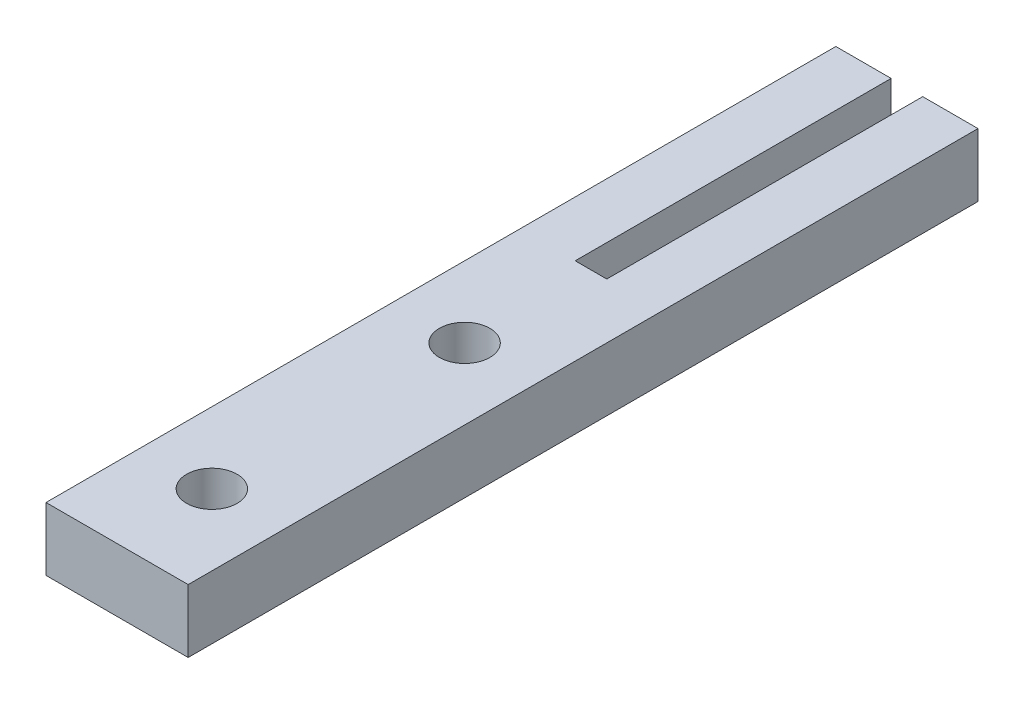
ISO-10303-21;
HEADER;
FILE_DESCRIPTION(('STEP AP214'),'2;1');
FILE_NAME('part.step','',(''),(''),'','','');
FILE_SCHEMA(('AUTOMOTIVE_DESIGN { 1 0 10303 214 1 1 1 1 }'));
ENDSEC;
DATA;
#1=APPLICATION_CONTEXT('core data for automotive mechanical design processes');
#2=APPLICATION_PROTOCOL_DEFINITION('international standard','automotive_design',2000,#1);
#3=PRODUCT_CONTEXT('',#1,'mechanical');
#4=PRODUCT('Part','Part','',(#3));
#5=PRODUCT_RELATED_PRODUCT_CATEGORY('part','',(#4));
#6=PRODUCT_DEFINITION_FORMATION('','',#4);
#7=PRODUCT_DEFINITION_CONTEXT('part definition',#1,'design');
#8=PRODUCT_DEFINITION('design','',#6,#7);
#9=PRODUCT_DEFINITION_SHAPE('','',#8);
#10=(LENGTH_UNIT() NAMED_UNIT(*) SI_UNIT(.MILLI.,.METRE.));
#11=(NAMED_UNIT(*) PLANE_ANGLE_UNIT() SI_UNIT($,.RADIAN.));
#12=(NAMED_UNIT(*) SI_UNIT($,.STERADIAN.) SOLID_ANGLE_UNIT());
#13=UNCERTAINTY_MEASURE_WITH_UNIT(LENGTH_MEASURE(1.E-05),#10,'distance_accuracy_value','');
#14=(GEOMETRIC_REPRESENTATION_CONTEXT(3) GLOBAL_UNCERTAINTY_ASSIGNED_CONTEXT((#13)) GLOBAL_UNIT_ASSIGNED_CONTEXT((#10,
#11,#12)) REPRESENTATION_CONTEXT('',''));
#15=CARTESIAN_POINT('',(0.,0.,0.));
#16=DIRECTION('',(0.,0.,1.));
#17=DIRECTION('',(1.,0.,0.));
#18=AXIS2_PLACEMENT_3D('',#15,#16,#17);
#19=CARTESIAN_POINT('',(0.,4.,-28.));
#20=DIRECTION('',(0.,0.,-1.));
#21=DIRECTION('',(-1.,0.,0.));
#22=AXIS2_PLACEMENT_3D('',#19,#20,#21);
#23=PLANE('',#22);
#24=DIRECTION('',(1.,0.,0.));
#25=VECTOR('',#24,1.);
#26=CARTESIAN_POINT('',(0.,2.,-28.));
#27=LINE('',#26,#25);
#28=CARTESIAN_POINT('',(-0.999999999999998,2.,-28.));
#29=VERTEX_POINT('',#28);
#30=CARTESIAN_POINT('',(0.999999999999994,2.,-28.));
#31=VERTEX_POINT('',#30);
#32=EDGE_CURVE('E109',#29,#31,#27,.T.);
#33=ORIENTED_EDGE('',*,*,#32,.T.);
#34=DIRECTION('',(0.,-1.,0.));
#35=VECTOR('',#34,1.);
#36=CARTESIAN_POINT('',(0.999999999999994,72.7009615312045,-28.));
#37=LINE('',#36,#35);
#38=CARTESIAN_POINT('',(0.999999999999994,4.,-28.));
#39=VERTEX_POINT('',#38);
#40=EDGE_CURVE('E124',#39,#31,#37,.T.);
#41=ORIENTED_EDGE('',*,*,#40,.F.);
#42=DIRECTION('',(1.,0.,0.));
#43=VECTOR('',#42,1.);
#44=CARTESIAN_POINT('',(0.,4.,-28.));
#45=LINE('',#44,#43);
#46=CARTESIAN_POINT('',(4.49999999999999,4.,-28.));
#47=VERTEX_POINT('',#46);
#48=EDGE_CURVE('E148',#39,#47,#45,.T.);
#49=ORIENTED_EDGE('',*,*,#48,.T.);
#50=DIRECTION('',(0.,-1.,0.));
#51=VECTOR('',#50,1.);
#52=CARTESIAN_POINT('',(4.49999999999999,4.,-28.));
#53=LINE('',#52,#51);
#54=CARTESIAN_POINT('',(4.49999999999999,0.,-28.));
#55=VERTEX_POINT('',#54);
#56=EDGE_CURVE('E171',#47,#55,#53,.T.);
#57=ORIENTED_EDGE('',*,*,#56,.T.);
#58=DIRECTION('',(1.,0.,0.));
#59=VECTOR('',#58,1.);
#60=CARTESIAN_POINT('',(0.,0.,-28.));
#61=LINE('',#60,#59);
#62=CARTESIAN_POINT('',(-4.5,0.,-28.));
#63=VERTEX_POINT('',#62);
#64=EDGE_CURVE('E165',#63,#55,#61,.T.);
#65=ORIENTED_EDGE('',*,*,#64,.F.);
#66=DIRECTION('',(0.,-1.,0.));
#67=VECTOR('',#66,1.);
#68=CARTESIAN_POINT('',(-4.5,4.,-28.));
#69=LINE('',#68,#67);
#70=CARTESIAN_POINT('',(-4.5,4.,-28.));
#71=VERTEX_POINT('',#70);
#72=EDGE_CURVE('E59',#71,#63,#69,.T.);
#73=ORIENTED_EDGE('',*,*,#72,.F.);
#74=CARTESIAN_POINT('',(-0.999999999999997,4.,-28.));
#75=VERTEX_POINT('',#74);
#76=EDGE_CURVE('E149',#71,#75,#45,.T.);
#77=ORIENTED_EDGE('',*,*,#76,.T.);
#78=DIRECTION('',(0.,-1.,0.));
#79=VECTOR('',#78,1.);
#80=CARTESIAN_POINT('',(-0.999999999999999,72.7009615312045,-28.));
#81=LINE('',#80,#79);
#82=EDGE_CURVE('E50',#75,#29,#81,.T.);
#83=ORIENTED_EDGE('',*,*,#82,.T.);
#84=EDGE_LOOP('',(#33,#41,#49,#57,#65,#73,#77,#83));
#85=FACE_BOUND('',#84,.T.);
#86=ADVANCED_FACE('F35',(#85),#23,.T.);
#87=CARTESIAN_POINT('',(0.,4.,0.));
#88=DIRECTION('',(0.,1.,0.));
#89=DIRECTION('',(0.,0.,1.));
#90=AXIS2_PLACEMENT_3D('',#87,#88,#89);
#91=PLANE('',#90);
#92=CARTESIAN_POINT('',(0.,4.,16.));
#93=DIRECTION('',(0.,1.,0.));
#94=DIRECTION('',(0.,0.,1.));
#95=AXIS2_PLACEMENT_3D('',#92,#93,#94);
#96=CIRCLE('',#95,1.6);
#97=CARTESIAN_POINT('',(0.,4.,17.6));
#98=VERTEX_POINT('',#97);
#99=EDGE_CURVE('E136',#98,#98,#96,.T.);
#100=ORIENTED_EDGE('',*,*,#99,.F.);
#101=EDGE_LOOP('',(#100));
#102=FACE_BOUND('',#101,.T.);
#103=CARTESIAN_POINT('',(0.,4.,0.));
#104=DIRECTION('',(0.,1.,0.));
#105=DIRECTION('',(0.,0.,1.));
#106=AXIS2_PLACEMENT_3D('',#103,#104,#105);
#107=CIRCLE('',#106,1.6);
#108=CARTESIAN_POINT('',(0.,4.,1.6));
#109=VERTEX_POINT('',#108);
#110=EDGE_CURVE('E151',#109,#109,#107,.T.);
#111=ORIENTED_EDGE('',*,*,#110,.F.);
#112=EDGE_LOOP('',(#111));
#113=FACE_BOUND('',#112,.T.);
#114=ORIENTED_EDGE('',*,*,#48,.F.);
#115=DIRECTION('',(0.,0.,-1.));
#116=VECTOR('',#115,1.);
#117=CARTESIAN_POINT('',(0.999999999999993,4.,-8.));
#118=LINE('',#117,#116);
#119=CARTESIAN_POINT('',(0.999999999999993,4.,-8.));
#120=VERTEX_POINT('',#119);
#121=EDGE_CURVE('E132',#120,#39,#118,.T.);
#122=ORIENTED_EDGE('',*,*,#121,.F.);
#123=DIRECTION('',(1.,0.,0.));
#124=VECTOR('',#123,1.);
#125=CARTESIAN_POINT('',(-0.999999999999996,4.,-8.));
#126=LINE('',#125,#124);
#127=CARTESIAN_POINT('',(-0.999999999999996,4.,-8.));
#128=VERTEX_POINT('',#127);
#129=EDGE_CURVE('E134',#128,#120,#126,.T.);
#130=ORIENTED_EDGE('',*,*,#129,.F.);
#131=DIRECTION('',(0.,0.,1.));
#132=VECTOR('',#131,1.);
#133=CARTESIAN_POINT('',(-0.999999999999999,4.,-28.));
#134=LINE('',#133,#132);
#135=EDGE_CURVE('E123',#75,#128,#134,.T.);
#136=ORIENTED_EDGE('',*,*,#135,.F.);
#137=ORIENTED_EDGE('',*,*,#76,.F.);
#138=DIRECTION('',(0.,0.,-1.));
#139=VECTOR('',#138,1.);
#140=CARTESIAN_POINT('',(-4.5,4.,0.));
#141=LINE('',#140,#139);
#142=CARTESIAN_POINT('',(-4.5,4.,22.));
#143=VERTEX_POINT('',#142);
#144=EDGE_CURVE('E139',#143,#71,#141,.T.);
#145=ORIENTED_EDGE('',*,*,#144,.F.);
#146=DIRECTION('',(-1.,0.,0.));
#147=VECTOR('',#146,1.);
#148=CARTESIAN_POINT('',(0.,4.,22.));
#149=LINE('',#148,#147);
#150=CARTESIAN_POINT('',(4.5,4.,22.));
#151=VERTEX_POINT('',#150);
#152=EDGE_CURVE('E142',#151,#143,#149,.T.);
#153=ORIENTED_EDGE('',*,*,#152,.F.);
#154=DIRECTION('',(0.,0.,1.));
#155=VECTOR('',#154,1.);
#156=CARTESIAN_POINT('',(4.5,4.,0.));
#157=LINE('',#156,#155);
#158=EDGE_CURVE('E145',#47,#151,#157,.T.);
#159=ORIENTED_EDGE('',*,*,#158,.F.);
#160=EDGE_LOOP('',(#114,#122,#130,#136,#137,#145,#153,#159));
#161=FACE_BOUND('',#160,.T.);
#162=ADVANCED_FACE('F187',(#102,#113,#161),#91,.T.);
#163=CARTESIAN_POINT('',(-4.5,4.,0.));
#164=DIRECTION('',(-1.,0.,0.));
#165=DIRECTION('',(0.,0.,1.));
#166=AXIS2_PLACEMENT_3D('',#163,#164,#165);
#167=PLANE('',#166);
#168=DIRECTION('',(0.,0.,-1.));
#169=VECTOR('',#168,1.);
#170=CARTESIAN_POINT('',(-4.5,0.,0.));
#171=LINE('',#170,#169);
#172=CARTESIAN_POINT('',(-4.5,0.,22.));
#173=VERTEX_POINT('',#172);
#174=EDGE_CURVE('E157',#173,#63,#171,.T.);
#175=ORIENTED_EDGE('',*,*,#174,.F.);
#176=DIRECTION('',(0.,-1.,0.));
#177=VECTOR('',#176,1.);
#178=CARTESIAN_POINT('',(-4.5,4.,22.));
#179=LINE('',#178,#177);
#180=EDGE_CURVE('E11',#143,#173,#179,.T.);
#181=ORIENTED_EDGE('',*,*,#180,.F.);
#182=ORIENTED_EDGE('',*,*,#144,.T.);
#183=ORIENTED_EDGE('',*,*,#72,.T.);
#184=EDGE_LOOP('',(#175,#181,#182,#183));
#185=FACE_BOUND('',#184,.T.);
#186=ADVANCED_FACE('F190',(#185),#167,.T.);
#187=CARTESIAN_POINT('',(0.,4.,22.));
#188=DIRECTION('',(0.,0.,1.));
#189=DIRECTION('',(1.,0.,0.));
#190=AXIS2_PLACEMENT_3D('',#187,#188,#189);
#191=PLANE('',#190);
#192=DIRECTION('',(-1.,0.,0.));
#193=VECTOR('',#192,1.);
#194=CARTESIAN_POINT('',(0.,0.,22.));
#195=LINE('',#194,#193);
#196=CARTESIAN_POINT('',(4.5,0.,22.));
#197=VERTEX_POINT('',#196);
#198=EDGE_CURVE('E159',#197,#173,#195,.T.);
#199=ORIENTED_EDGE('',*,*,#198,.F.);
#200=DIRECTION('',(0.,-1.,0.));
#201=VECTOR('',#200,1.);
#202=CARTESIAN_POINT('',(4.5,4.,22.));
#203=LINE('',#202,#201);
#204=EDGE_CURVE('E43',#151,#197,#203,.T.);
#205=ORIENTED_EDGE('',*,*,#204,.F.);
#206=ORIENTED_EDGE('',*,*,#152,.T.);
#207=ORIENTED_EDGE('',*,*,#180,.T.);
#208=EDGE_LOOP('',(#199,#205,#206,#207));
#209=FACE_BOUND('',#208,.T.);
#210=ADVANCED_FACE('F180',(#209),#191,.T.);
#211=CARTESIAN_POINT('',(4.5,4.,0.));
#212=DIRECTION('',(1.,0.,0.));
#213=DIRECTION('',(0.,0.,-1.));
#214=AXIS2_PLACEMENT_3D('',#211,#212,#213);
#215=PLANE('',#214);
#216=DIRECTION('',(0.,0.,1.));
#217=VECTOR('',#216,1.);
#218=CARTESIAN_POINT('',(4.5,0.,0.));
#219=LINE('',#218,#217);
#220=EDGE_CURVE('E162',#55,#197,#219,.T.);
#221=ORIENTED_EDGE('',*,*,#220,.F.);
#222=ORIENTED_EDGE('',*,*,#56,.F.);
#223=ORIENTED_EDGE('',*,*,#158,.T.);
#224=ORIENTED_EDGE('',*,*,#204,.T.);
#225=EDGE_LOOP('',(#221,#222,#223,#224));
#226=FACE_BOUND('',#225,.T.);
#227=ADVANCED_FACE('F175',(#226),#215,.T.);
#228=CARTESIAN_POINT('',(0.,4.,16.));
#229=DIRECTION('',(0.,-1.,0.));
#230=DIRECTION('',(0.,0.,-1.));
#231=AXIS2_PLACEMENT_3D('',#228,#229,#230);
#232=CYLINDRICAL_SURFACE('',#231,1.6);
#233=ORIENTED_EDGE('',*,*,#99,.T.);
#234=EDGE_LOOP('',(#233));
#235=FACE_BOUND('',#234,.T.);
#236=CARTESIAN_POINT('',(0.,0.,16.));
#237=DIRECTION('',(0.,1.,0.));
#238=DIRECTION('',(0.,0.,1.));
#239=AXIS2_PLACEMENT_3D('',#236,#237,#238);
#240=CIRCLE('',#239,1.6);
#241=CARTESIAN_POINT('',(0.,0.,17.6));
#242=VERTEX_POINT('',#241);
#243=EDGE_CURVE('E154',#242,#242,#240,.T.);
#244=ORIENTED_EDGE('',*,*,#243,.F.);
#245=EDGE_LOOP('',(#244));
#246=FACE_BOUND('',#245,.T.);
#247=ADVANCED_FACE('F37',(#235,#246),#232,.F.);
#248=CARTESIAN_POINT('',(0.,4.,0.));
#249=DIRECTION('',(0.,-1.,0.));
#250=DIRECTION('',(0.,0.,-1.));
#251=AXIS2_PLACEMENT_3D('',#248,#249,#250);
#252=CYLINDRICAL_SURFACE('',#251,1.6);
#253=ORIENTED_EDGE('',*,*,#110,.T.);
#254=EDGE_LOOP('',(#253));
#255=FACE_BOUND('',#254,.T.);
#256=CARTESIAN_POINT('',(0.,0.,0.));
#257=DIRECTION('',(0.,1.,0.));
#258=DIRECTION('',(0.,0.,1.));
#259=AXIS2_PLACEMENT_3D('',#256,#257,#258);
#260=CIRCLE('',#259,1.6);
#261=CARTESIAN_POINT('',(0.,0.,1.6));
#262=VERTEX_POINT('',#261);
#263=EDGE_CURVE('E140',#262,#262,#260,.T.);
#264=ORIENTED_EDGE('',*,*,#263,.F.);
#265=EDGE_LOOP('',(#264));
#266=FACE_BOUND('',#265,.T.);
#267=ADVANCED_FACE('F205',(#255,#266),#252,.F.);
#268=CARTESIAN_POINT('',(0.,0.,0.));
#269=DIRECTION('',(0.,1.,0.));
#270=DIRECTION('',(0.,0.,1.));
#271=AXIS2_PLACEMENT_3D('',#268,#269,#270);
#272=PLANE('',#271);
#273=ORIENTED_EDGE('',*,*,#243,.T.);
#274=EDGE_LOOP('',(#273));
#275=FACE_BOUND('',#274,.T.);
#276=ORIENTED_EDGE('',*,*,#174,.T.);
#277=ORIENTED_EDGE('',*,*,#64,.T.);
#278=ORIENTED_EDGE('',*,*,#220,.T.);
#279=ORIENTED_EDGE('',*,*,#198,.T.);
#280=EDGE_LOOP('',(#276,#277,#278,#279));
#281=FACE_BOUND('',#280,.T.);
#282=ORIENTED_EDGE('',*,*,#263,.T.);
#283=EDGE_LOOP('',(#282));
#284=FACE_BOUND('',#283,.T.);
#285=ADVANCED_FACE('F182',(#275,#281,#284),#272,.F.);
#286=CARTESIAN_POINT('',(0.999999999999993,72.7009615312045,-8.));
#287=DIRECTION('',(-1.,0.,0.));
#288=DIRECTION('',(0.,0.,1.));
#289=AXIS2_PLACEMENT_3D('',#286,#287,#288);
#290=PLANE('',#289);
#291=DIRECTION('',(0.,-1.,0.));
#292=VECTOR('',#291,1.);
#293=CARTESIAN_POINT('',(0.999999999999993,72.7009615312045,-8.));
#294=LINE('',#293,#292);
#295=CARTESIAN_POINT('',(0.999999999999993,2.,-8.));
#296=VERTEX_POINT('',#295);
#297=EDGE_CURVE('E119',#120,#296,#294,.T.);
#298=ORIENTED_EDGE('',*,*,#297,.F.);
#299=ORIENTED_EDGE('',*,*,#121,.T.);
#300=ORIENTED_EDGE('',*,*,#40,.T.);
#301=DIRECTION('',(0.,0.,-1.));
#302=VECTOR('',#301,1.);
#303=CARTESIAN_POINT('',(0.999999999999993,2.,-8.));
#304=LINE('',#303,#302);
#305=EDGE_CURVE('E120',#296,#31,#304,.T.);
#306=ORIENTED_EDGE('',*,*,#305,.F.);
#307=EDGE_LOOP('',(#298,#299,#300,#306));
#308=FACE_BOUND('',#307,.T.);
#309=ADVANCED_FACE('F221',(#308),#290,.T.);
#310=CARTESIAN_POINT('',(-0.999999999999996,72.7009615312045,-8.));
#311=DIRECTION('',(0.,0.,-1.));
#312=DIRECTION('',(-1.,0.,0.));
#313=AXIS2_PLACEMENT_3D('',#310,#311,#312);
#314=PLANE('',#313);
#315=DIRECTION('',(0.,-1.,0.));
#316=VECTOR('',#315,1.);
#317=CARTESIAN_POINT('',(-0.999999999999996,72.7009615312045,-8.));
#318=LINE('',#317,#316);
#319=CARTESIAN_POINT('',(-0.999999999999996,2.,-8.));
#320=VERTEX_POINT('',#319);
#321=EDGE_CURVE('E116',#128,#320,#318,.T.);
#322=ORIENTED_EDGE('',*,*,#321,.F.);
#323=ORIENTED_EDGE('',*,*,#129,.T.);
#324=ORIENTED_EDGE('',*,*,#297,.T.);
#325=DIRECTION('',(1.,0.,0.));
#326=VECTOR('',#325,1.);
#327=CARTESIAN_POINT('',(-0.999999999999996,2.,-8.));
#328=LINE('',#327,#326);
#329=EDGE_CURVE('E106',#320,#296,#328,.T.);
#330=ORIENTED_EDGE('',*,*,#329,.F.);
#331=EDGE_LOOP('',(#322,#323,#324,#330));
#332=FACE_BOUND('',#331,.T.);
#333=ADVANCED_FACE('F115',(#332),#314,.T.);
#334=CARTESIAN_POINT('',(-0.999999999999999,72.7009615312045,-28.));
#335=DIRECTION('',(1.,0.,0.));
#336=DIRECTION('',(0.,0.,-1.));
#337=AXIS2_PLACEMENT_3D('',#334,#335,#336);
#338=PLANE('',#337);
#339=ORIENTED_EDGE('',*,*,#82,.F.);
#340=ORIENTED_EDGE('',*,*,#135,.T.);
#341=ORIENTED_EDGE('',*,*,#321,.T.);
#342=DIRECTION('',(0.,0.,1.));
#343=VECTOR('',#342,1.);
#344=CARTESIAN_POINT('',(-0.999999999999999,2.,-28.));
#345=LINE('',#344,#343);
#346=EDGE_CURVE('E103',#29,#320,#345,.T.);
#347=ORIENTED_EDGE('',*,*,#346,.F.);
#348=EDGE_LOOP('',(#339,#340,#341,#347));
#349=FACE_BOUND('',#348,.T.);
#350=ADVANCED_FACE('F122',(#349),#338,.T.);
#351=CARTESIAN_POINT('',(0.,2.,0.));
#352=DIRECTION('',(0.,1.,0.));
#353=DIRECTION('',(0.,0.,1.));
#354=AXIS2_PLACEMENT_3D('',#351,#352,#353);
#355=PLANE('',#354);
#356=ORIENTED_EDGE('',*,*,#346,.T.);
#357=ORIENTED_EDGE('',*,*,#329,.T.);
#358=ORIENTED_EDGE('',*,*,#305,.T.);
#359=ORIENTED_EDGE('',*,*,#32,.F.);
#360=EDGE_LOOP('',(#356,#357,#358,#359));
#361=FACE_BOUND('',#360,.T.);
#362=ADVANCED_FACE('F105',(#361),#355,.T.);
#363=CLOSED_SHELL('',(#86,#162,#186,#210,#227,#247,#267,#285,#309,#333,#350,#362));
#364=MANIFOLD_SOLID_BREP('B2',#363);
#365=ADVANCED_BREP_SHAPE_REPRESENTATION('',(#18,#364),#14);
#366=SHAPE_DEFINITION_REPRESENTATION(#9,#365);
ENDSEC;
END-ISO-10303-21;
